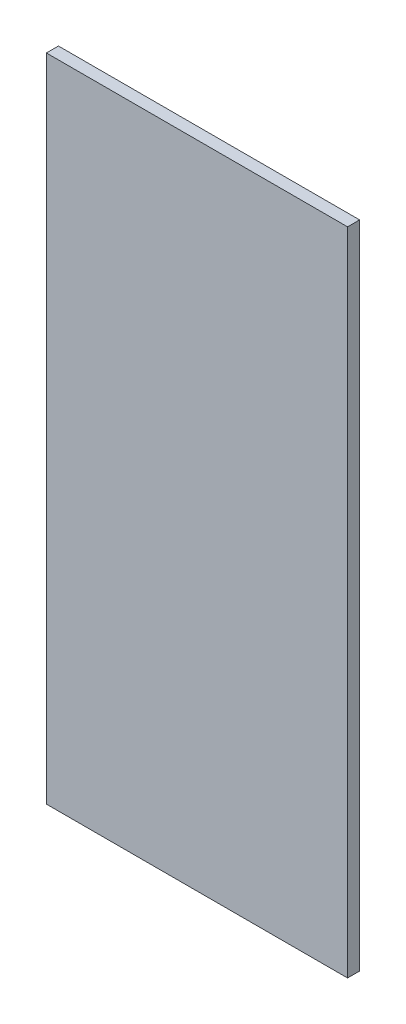
ISO-10303-21;
HEADER;
FILE_DESCRIPTION(('STEP AP214'),'2;1');
FILE_NAME('part.step','',(''),(''),'','','');
FILE_SCHEMA(('AUTOMOTIVE_DESIGN { 1 0 10303 214 1 1 1 1 }'));
ENDSEC;
DATA;
#1=APPLICATION_CONTEXT('core data for automotive mechanical design processes');
#2=APPLICATION_PROTOCOL_DEFINITION('international standard','automotive_design',2000,#1);
#3=PRODUCT_CONTEXT('',#1,'mechanical');
#4=PRODUCT('Part','Part','',(#3));
#5=PRODUCT_RELATED_PRODUCT_CATEGORY('part','',(#4));
#6=PRODUCT_DEFINITION_FORMATION('','',#4);
#7=PRODUCT_DEFINITION_CONTEXT('part definition',#1,'design');
#8=PRODUCT_DEFINITION('design','',#6,#7);
#9=PRODUCT_DEFINITION_SHAPE('','',#8);
#10=(LENGTH_UNIT() NAMED_UNIT(*) SI_UNIT(.MILLI.,.METRE.));
#11=(NAMED_UNIT(*) PLANE_ANGLE_UNIT() SI_UNIT($,.RADIAN.));
#12=(NAMED_UNIT(*) SI_UNIT($,.STERADIAN.) SOLID_ANGLE_UNIT());
#13=UNCERTAINTY_MEASURE_WITH_UNIT(LENGTH_MEASURE(1.E-05),#10,'distance_accuracy_value','');
#14=(GEOMETRIC_REPRESENTATION_CONTEXT(3) GLOBAL_UNCERTAINTY_ASSIGNED_CONTEXT((#13)) GLOBAL_UNIT_ASSIGNED_CONTEXT((#10,
#11,#12)) REPRESENTATION_CONTEXT('',''));
#15=CARTESIAN_POINT('',(0.,0.,0.));
#16=DIRECTION('',(0.,0.,1.));
#17=DIRECTION('',(1.,0.,0.));
#18=AXIS2_PLACEMENT_3D('',#15,#16,#17);
#19=CARTESIAN_POINT('',(0.,0.,5.));
#20=DIRECTION('',(1.,0.,0.));
#21=DIRECTION('',(0.,1.,0.));
#22=AXIS2_PLACEMENT_3D('',#19,#20,#21);
#23=PLANE('',#22);
#24=DIRECTION('',(0.,-1.,0.));
#25=VECTOR('',#24,1.);
#26=CARTESIAN_POINT('',(0.,0.,0.));
#27=LINE('',#26,#25);
#28=CARTESIAN_POINT('',(0.,0.,0.));
#29=VERTEX_POINT('',#28);
#30=CARTESIAN_POINT('',(0.,-270.,0.));
#31=VERTEX_POINT('',#30);
#32=EDGE_CURVE('E107',#29,#31,#27,.T.);
#33=ORIENTED_EDGE('',*,*,#32,.T.);
#34=DIRECTION('',(0.,0.,-1.));
#35=VECTOR('',#34,1.);
#36=CARTESIAN_POINT('',(0.,-270.,5.));
#37=LINE('',#36,#35);
#38=CARTESIAN_POINT('',(0.,-270.,5.));
#39=VERTEX_POINT('',#38);
#40=EDGE_CURVE('E11',#39,#31,#37,.T.);
#41=ORIENTED_EDGE('',*,*,#40,.F.);
#42=DIRECTION('',(0.,-1.,0.));
#43=VECTOR('',#42,1.);
#44=CARTESIAN_POINT('',(0.,0.,5.));
#45=LINE('',#44,#43);
#46=CARTESIAN_POINT('',(0.,0.,5.));
#47=VERTEX_POINT('',#46);
#48=EDGE_CURVE('E91',#47,#39,#45,.T.);
#49=ORIENTED_EDGE('',*,*,#48,.F.);
#50=DIRECTION('',(0.,0.,-1.));
#51=VECTOR('',#50,1.);
#52=CARTESIAN_POINT('',(0.,0.,5.));
#53=LINE('',#52,#51);
#54=EDGE_CURVE('E103',#47,#29,#53,.T.);
#55=ORIENTED_EDGE('',*,*,#54,.T.);
#56=EDGE_LOOP('',(#33,#41,#49,#55));
#57=FACE_BOUND('',#56,.T.);
#58=ADVANCED_FACE('F39',(#57),#23,.F.);
#59=CARTESIAN_POINT('',(0.,-270.,5.));
#60=DIRECTION('',(0.,1.,0.));
#61=DIRECTION('',(0.,0.,1.));
#62=AXIS2_PLACEMENT_3D('',#59,#60,#61);
#63=PLANE('',#62);
#64=DIRECTION('',(1.,0.,0.));
#65=VECTOR('',#64,1.);
#66=CARTESIAN_POINT('',(0.,-270.,0.));
#67=LINE('',#66,#65);
#68=CARTESIAN_POINT('',(125.,-270.,0.));
#69=VERTEX_POINT('',#68);
#70=EDGE_CURVE('E96',#31,#69,#67,.T.);
#71=ORIENTED_EDGE('',*,*,#70,.T.);
#72=DIRECTION('',(0.,0.,-1.));
#73=VECTOR('',#72,1.);
#74=CARTESIAN_POINT('',(125.,-270.,5.));
#75=LINE('',#74,#73);
#76=CARTESIAN_POINT('',(125.,-270.,5.));
#77=VERTEX_POINT('',#76);
#78=EDGE_CURVE('E48',#77,#69,#75,.T.);
#79=ORIENTED_EDGE('',*,*,#78,.F.);
#80=DIRECTION('',(1.,0.,0.));
#81=VECTOR('',#80,1.);
#82=CARTESIAN_POINT('',(0.,-270.,5.));
#83=LINE('',#82,#81);
#84=EDGE_CURVE('E86',#39,#77,#83,.T.);
#85=ORIENTED_EDGE('',*,*,#84,.F.);
#86=ORIENTED_EDGE('',*,*,#40,.T.);
#87=EDGE_LOOP('',(#71,#79,#85,#86));
#88=FACE_BOUND('',#87,.T.);
#89=ADVANCED_FACE('F95',(#88),#63,.F.);
#90=CARTESIAN_POINT('',(125.,0.,5.));
#91=DIRECTION('',(-1.,0.,0.));
#92=DIRECTION('',(0.,-1.,0.));
#93=AXIS2_PLACEMENT_3D('',#90,#91,#92);
#94=PLANE('',#93);
#95=DIRECTION('',(0.,1.,0.));
#96=VECTOR('',#95,1.);
#97=CARTESIAN_POINT('',(125.,0.,0.));
#98=LINE('',#97,#96);
#99=CARTESIAN_POINT('',(125.,0.,0.));
#100=VERTEX_POINT('',#99);
#101=EDGE_CURVE('E73',#69,#100,#98,.T.);
#102=ORIENTED_EDGE('',*,*,#101,.T.);
#103=DIRECTION('',(0.,0.,-1.));
#104=VECTOR('',#103,1.);
#105=CARTESIAN_POINT('',(125.,0.,5.));
#106=LINE('',#105,#104);
#107=CARTESIAN_POINT('',(125.,0.,5.));
#108=VERTEX_POINT('',#107);
#109=EDGE_CURVE('E98',#108,#100,#106,.T.);
#110=ORIENTED_EDGE('',*,*,#109,.F.);
#111=DIRECTION('',(0.,1.,0.));
#112=VECTOR('',#111,1.);
#113=CARTESIAN_POINT('',(125.,0.,5.));
#114=LINE('',#113,#112);
#115=EDGE_CURVE('E89',#77,#108,#114,.T.);
#116=ORIENTED_EDGE('',*,*,#115,.F.);
#117=ORIENTED_EDGE('',*,*,#78,.T.);
#118=EDGE_LOOP('',(#102,#110,#116,#117));
#119=FACE_BOUND('',#118,.T.);
#120=ADVANCED_FACE('F99',(#119),#94,.F.);
#121=CARTESIAN_POINT('',(0.,0.,5.));
#122=DIRECTION('',(0.,-1.,0.));
#123=DIRECTION('',(0.,0.,-1.));
#124=AXIS2_PLACEMENT_3D('',#121,#122,#123);
#125=PLANE('',#124);
#126=DIRECTION('',(-1.,0.,0.));
#127=VECTOR('',#126,1.);
#128=CARTESIAN_POINT('',(0.,0.,0.));
#129=LINE('',#128,#127);
#130=EDGE_CURVE('E79',#100,#29,#129,.T.);
#131=ORIENTED_EDGE('',*,*,#130,.T.);
#132=ORIENTED_EDGE('',*,*,#54,.F.);
#133=DIRECTION('',(-1.,0.,0.));
#134=VECTOR('',#133,1.);
#135=CARTESIAN_POINT('',(0.,0.,5.));
#136=LINE('',#135,#134);
#137=EDGE_CURVE('E56',#108,#47,#136,.T.);
#138=ORIENTED_EDGE('',*,*,#137,.F.);
#139=ORIENTED_EDGE('',*,*,#109,.T.);
#140=EDGE_LOOP('',(#131,#132,#138,#139));
#141=FACE_BOUND('',#140,.T.);
#142=ADVANCED_FACE('F120',(#141),#125,.F.);
#143=CARTESIAN_POINT('',(0.,0.,5.));
#144=DIRECTION('',(0.,0.,1.));
#145=DIRECTION('',(1.,0.,0.));
#146=AXIS2_PLACEMENT_3D('',#143,#144,#145);
#147=PLANE('',#146);
#148=ORIENTED_EDGE('',*,*,#48,.T.);
#149=ORIENTED_EDGE('',*,*,#84,.T.);
#150=ORIENTED_EDGE('',*,*,#115,.T.);
#151=ORIENTED_EDGE('',*,*,#137,.T.);
#152=EDGE_LOOP('',(#148,#149,#150,#151));
#153=FACE_BOUND('',#152,.T.);
#154=ADVANCED_FACE('F87',(#153),#147,.T.);
#155=CARTESIAN_POINT('',(0.,0.,0.));
#156=DIRECTION('',(0.,0.,1.));
#157=DIRECTION('',(1.,0.,0.));
#158=AXIS2_PLACEMENT_3D('',#155,#156,#157);
#159=PLANE('',#158);
#160=ORIENTED_EDGE('',*,*,#32,.F.);
#161=ORIENTED_EDGE('',*,*,#130,.F.);
#162=ORIENTED_EDGE('',*,*,#101,.F.);
#163=ORIENTED_EDGE('',*,*,#70,.F.);
#164=EDGE_LOOP('',(#160,#161,#162,#163));
#165=FACE_BOUND('',#164,.T.);
#166=ADVANCED_FACE('F123',(#165),#159,.F.);
#167=CLOSED_SHELL('',(#58,#89,#120,#142,#154,#166));
#168=MANIFOLD_SOLID_BREP('B2',#167);
#169=ADVANCED_BREP_SHAPE_REPRESENTATION('',(#18,#168),#14);
#170=SHAPE_DEFINITION_REPRESENTATION(#9,#169);
ENDSEC;
END-ISO-10303-21;
